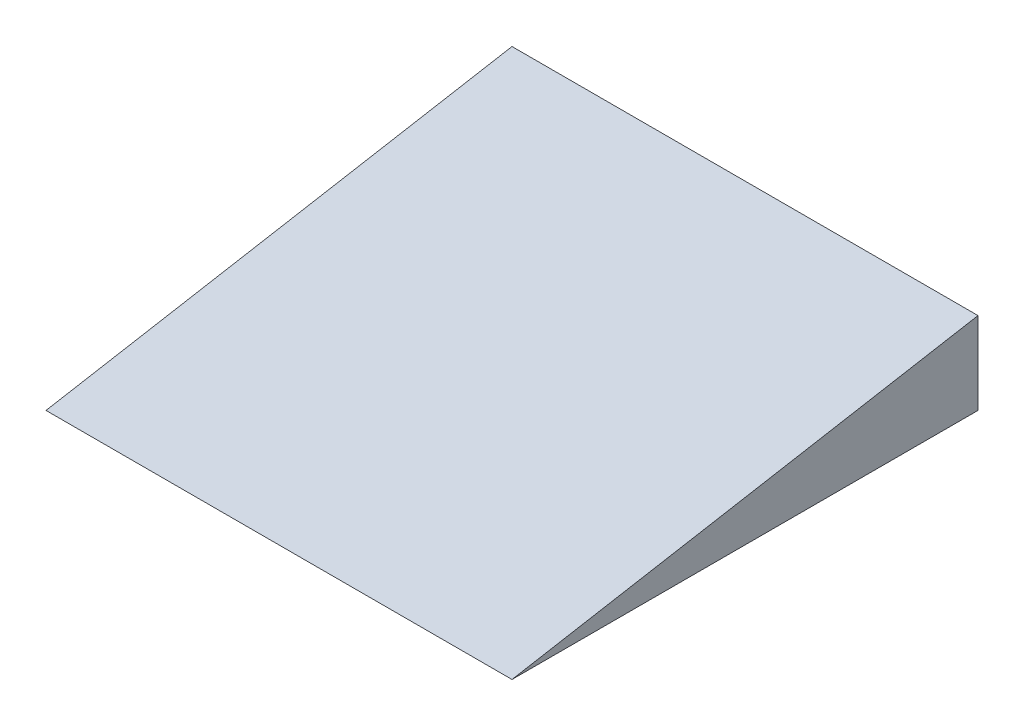
ISO-10303-21;
HEADER;
FILE_DESCRIPTION(('STEP AP214'),'2;1');
FILE_NAME('part.step','',(''),(''),'','','');
FILE_SCHEMA(('AUTOMOTIVE_DESIGN { 1 0 10303 214 1 1 1 1 }'));
ENDSEC;
DATA;
#1=APPLICATION_CONTEXT('core data for automotive mechanical design processes');
#2=APPLICATION_PROTOCOL_DEFINITION('international standard','automotive_design',2000,#1);
#3=PRODUCT_CONTEXT('',#1,'mechanical');
#4=PRODUCT('Part','Part','',(#3));
#5=PRODUCT_RELATED_PRODUCT_CATEGORY('part','',(#4));
#6=PRODUCT_DEFINITION_FORMATION('','',#4);
#7=PRODUCT_DEFINITION_CONTEXT('part definition',#1,'design');
#8=PRODUCT_DEFINITION('design','',#6,#7);
#9=PRODUCT_DEFINITION_SHAPE('','',#8);
#10=(LENGTH_UNIT() NAMED_UNIT(*) SI_UNIT(.MILLI.,.METRE.));
#11=(NAMED_UNIT(*) PLANE_ANGLE_UNIT() SI_UNIT($,.RADIAN.));
#12=(NAMED_UNIT(*) SI_UNIT($,.STERADIAN.) SOLID_ANGLE_UNIT());
#13=UNCERTAINTY_MEASURE_WITH_UNIT(LENGTH_MEASURE(1.E-05),#10,'distance_accuracy_value','');
#14=(GEOMETRIC_REPRESENTATION_CONTEXT(3) GLOBAL_UNCERTAINTY_ASSIGNED_CONTEXT((#13)) GLOBAL_UNIT_ASSIGNED_CONTEXT((#10,
#11,#12)) REPRESENTATION_CONTEXT('',''));
#15=CARTESIAN_POINT('',(0.,0.,0.));
#16=DIRECTION('',(0.,0.,1.));
#17=DIRECTION('',(1.,0.,0.));
#18=AXIS2_PLACEMENT_3D('',#15,#16,#17);
#19=CARTESIAN_POINT('',(40.,7.05307922833832,-40.));
#20=DIRECTION('',(0.,-0.984807753012209,-0.173648177666924));
#21=DIRECTION('',(0.,0.173648177666924,-0.984807753012209));
#22=AXIS2_PLACEMENT_3D('',#19,#20,#21);
#23=PLANE('',#22);
#24=DIRECTION('',(0.,-0.173648177666924,0.984807753012209));
#25=VECTOR('',#24,1.);
#26=CARTESIAN_POINT('',(0.,7.05307922833832,-40.));
#27=LINE('',#26,#25);
#28=CARTESIAN_POINT('',(0.,7.05307922833832,-40.));
#29=VERTEX_POINT('',#28);
#30=CARTESIAN_POINT('',(0.,0.,0.));
#31=VERTEX_POINT('',#30);
#32=EDGE_CURVE('E82',#29,#31,#27,.T.);
#33=ORIENTED_EDGE('',*,*,#32,.T.);
#34=DIRECTION('',(-1.,0.,0.));
#35=VECTOR('',#34,1.);
#36=CARTESIAN_POINT('',(40.,0.,0.));
#37=LINE('',#36,#35);
#38=CARTESIAN_POINT('',(40.,0.,0.));
#39=VERTEX_POINT('',#38);
#40=EDGE_CURVE('E11',#39,#31,#37,.T.);
#41=ORIENTED_EDGE('',*,*,#40,.F.);
#42=DIRECTION('',(0.,-0.173648177666924,0.984807753012209));
#43=VECTOR('',#42,1.);
#44=CARTESIAN_POINT('',(40.,7.05307922833832,-40.));
#45=LINE('',#44,#43);
#46=CARTESIAN_POINT('',(40.,7.05307922833832,-40.));
#47=VERTEX_POINT('',#46);
#48=EDGE_CURVE('E75',#47,#39,#45,.T.);
#49=ORIENTED_EDGE('',*,*,#48,.F.);
#50=DIRECTION('',(-1.,0.,0.));
#51=VECTOR('',#50,1.);
#52=CARTESIAN_POINT('',(40.,7.05307922833832,-40.));
#53=LINE('',#52,#51);
#54=EDGE_CURVE('E83',#47,#29,#53,.T.);
#55=ORIENTED_EDGE('',*,*,#54,.T.);
#56=EDGE_LOOP('',(#33,#41,#49,#55));
#57=FACE_BOUND('',#56,.T.);
#58=ADVANCED_FACE('F35',(#57),#23,.F.);
#59=CARTESIAN_POINT('',(40.,0.,0.));
#60=DIRECTION('',(0.,1.,0.));
#61=DIRECTION('',(0.,0.,1.));
#62=AXIS2_PLACEMENT_3D('',#59,#60,#61);
#63=PLANE('',#62);
#64=DIRECTION('',(0.,0.,-1.));
#65=VECTOR('',#64,1.);
#66=CARTESIAN_POINT('',(0.,0.,0.));
#67=LINE('',#66,#65);
#68=CARTESIAN_POINT('',(0.,0.,-40.));
#69=VERTEX_POINT('',#68);
#70=EDGE_CURVE('E63',#31,#69,#67,.T.);
#71=ORIENTED_EDGE('',*,*,#70,.T.);
#72=DIRECTION('',(-1.,0.,0.));
#73=VECTOR('',#72,1.);
#74=CARTESIAN_POINT('',(40.,0.,-40.));
#75=LINE('',#74,#73);
#76=CARTESIAN_POINT('',(40.,0.,-40.));
#77=VERTEX_POINT('',#76);
#78=EDGE_CURVE('E43',#77,#69,#75,.T.);
#79=ORIENTED_EDGE('',*,*,#78,.F.);
#80=DIRECTION('',(0.,0.,-1.));
#81=VECTOR('',#80,1.);
#82=CARTESIAN_POINT('',(40.,0.,0.));
#83=LINE('',#82,#81);
#84=EDGE_CURVE('E71',#39,#77,#83,.T.);
#85=ORIENTED_EDGE('',*,*,#84,.F.);
#86=ORIENTED_EDGE('',*,*,#40,.T.);
#87=EDGE_LOOP('',(#71,#79,#85,#86));
#88=FACE_BOUND('',#87,.T.);
#89=ADVANCED_FACE('F72',(#88),#63,.F.);
#90=CARTESIAN_POINT('',(40.,0.,-40.));
#91=DIRECTION('',(0.,0.,1.));
#92=DIRECTION('',(1.,0.,0.));
#93=AXIS2_PLACEMENT_3D('',#90,#91,#92);
#94=PLANE('',#93);
#95=DIRECTION('',(0.,1.,0.));
#96=VECTOR('',#95,1.);
#97=CARTESIAN_POINT('',(0.,0.,-40.));
#98=LINE('',#97,#96);
#99=EDGE_CURVE('E68',#69,#29,#98,.T.);
#100=ORIENTED_EDGE('',*,*,#99,.T.);
#101=ORIENTED_EDGE('',*,*,#54,.F.);
#102=DIRECTION('',(0.,1.,0.));
#103=VECTOR('',#102,1.);
#104=CARTESIAN_POINT('',(40.,0.,-40.));
#105=LINE('',#104,#103);
#106=EDGE_CURVE('E51',#77,#47,#105,.T.);
#107=ORIENTED_EDGE('',*,*,#106,.F.);
#108=ORIENTED_EDGE('',*,*,#78,.T.);
#109=EDGE_LOOP('',(#100,#101,#107,#108));
#110=FACE_BOUND('',#109,.T.);
#111=ADVANCED_FACE('F90',(#110),#94,.F.);
#112=CARTESIAN_POINT('',(40.,0.,0.));
#113=DIRECTION('',(-1.,0.,0.));
#114=DIRECTION('',(0.,0.,1.));
#115=AXIS2_PLACEMENT_3D('',#112,#113,#114);
#116=PLANE('',#115);
#117=ORIENTED_EDGE('',*,*,#48,.T.);
#118=ORIENTED_EDGE('',*,*,#84,.T.);
#119=ORIENTED_EDGE('',*,*,#106,.T.);
#120=EDGE_LOOP('',(#117,#118,#119));
#121=FACE_BOUND('',#120,.T.);
#122=ADVANCED_FACE('F78',(#121),#116,.F.);
#123=CARTESIAN_POINT('',(0.,0.,0.));
#124=DIRECTION('',(-1.,0.,0.));
#125=DIRECTION('',(0.,0.,1.));
#126=AXIS2_PLACEMENT_3D('',#123,#124,#125);
#127=PLANE('',#126);
#128=ORIENTED_EDGE('',*,*,#32,.F.);
#129=ORIENTED_EDGE('',*,*,#99,.F.);
#130=ORIENTED_EDGE('',*,*,#70,.F.);
#131=EDGE_LOOP('',(#128,#129,#130));
#132=FACE_BOUND('',#131,.T.);
#133=ADVANCED_FACE('F91',(#132),#127,.T.);
#134=CLOSED_SHELL('',(#58,#89,#111,#122,#133));
#135=MANIFOLD_SOLID_BREP('B2',#134);
#136=ADVANCED_BREP_SHAPE_REPRESENTATION('',(#18,#135),#14);
#137=SHAPE_DEFINITION_REPRESENTATION(#9,#136);
ENDSEC;
END-ISO-10303-21;
